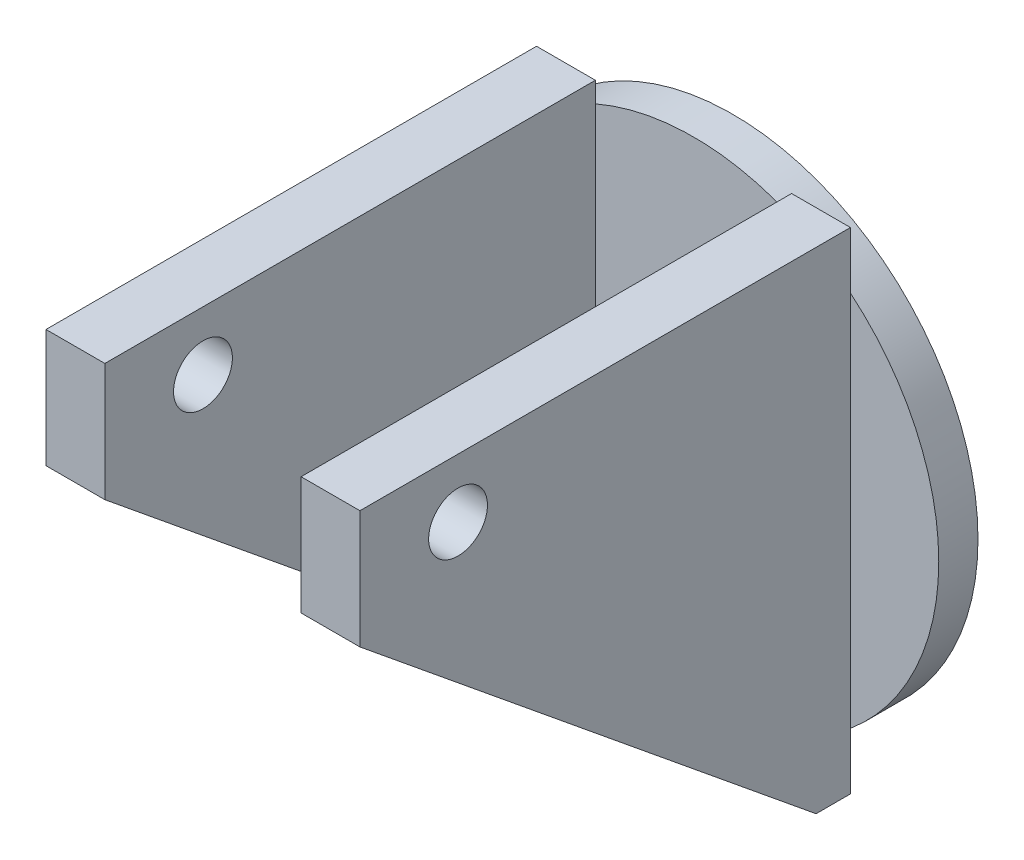
ISO-10303-21;
HEADER;
FILE_DESCRIPTION(('STEP AP214'),'2;1');
FILE_NAME('part.step','',(''),(''),'','','');
FILE_SCHEMA(('AUTOMOTIVE_DESIGN { 1 0 10303 214 1 1 1 1 }'));
ENDSEC;
DATA;
#1=APPLICATION_CONTEXT('core data for automotive mechanical design processes');
#2=APPLICATION_PROTOCOL_DEFINITION('international standard','automotive_design',2000,#1);
#3=PRODUCT_CONTEXT('',#1,'mechanical');
#4=PRODUCT('Part','Part','',(#3));
#5=PRODUCT_RELATED_PRODUCT_CATEGORY('part','',(#4));
#6=PRODUCT_DEFINITION_FORMATION('','',#4);
#7=PRODUCT_DEFINITION_CONTEXT('part definition',#1,'design');
#8=PRODUCT_DEFINITION('design','',#6,#7);
#9=PRODUCT_DEFINITION_SHAPE('','',#8);
#10=(LENGTH_UNIT() NAMED_UNIT(*) SI_UNIT(.MILLI.,.METRE.));
#11=(NAMED_UNIT(*) PLANE_ANGLE_UNIT() SI_UNIT($,.RADIAN.));
#12=(NAMED_UNIT(*) SI_UNIT($,.STERADIAN.) SOLID_ANGLE_UNIT());
#13=UNCERTAINTY_MEASURE_WITH_UNIT(LENGTH_MEASURE(1.E-05),#10,'distance_accuracy_value','');
#14=(GEOMETRIC_REPRESENTATION_CONTEXT(3) GLOBAL_UNCERTAINTY_ASSIGNED_CONTEXT((#13)) GLOBAL_UNIT_ASSIGNED_CONTEXT((#10,
#11,#12)) REPRESENTATION_CONTEXT('',''));
#15=CARTESIAN_POINT('',(0.,0.,0.));
#16=DIRECTION('',(0.,0.,1.));
#17=DIRECTION('',(1.,0.,0.));
#18=AXIS2_PLACEMENT_3D('',#15,#16,#17);
#19=CARTESIAN_POINT('',(0.,0.,2.));
#20=DIRECTION('',(0.,0.,1.));
#21=DIRECTION('',(1.,0.,0.));
#22=AXIS2_PLACEMENT_3D('',#19,#20,#21);
#23=PLANE('',#22);
#24=DIRECTION('',(0.,1.,0.));
#25=VECTOR('',#24,1.);
#26=CARTESIAN_POINT('',(8.,0.,2.));
#27=LINE('',#26,#25);
#28=CARTESIAN_POINT('',(8.,-9.60468635614927,2.));
#29=VERTEX_POINT('',#28);
#30=CARTESIAN_POINT('',(8.,9.60468635614927,2.));
#31=VERTEX_POINT('',#30);
#32=EDGE_CURVE('E40',#29,#31,#27,.T.);
#33=ORIENTED_EDGE('',*,*,#32,.F.);
#34=CARTESIAN_POINT('',(0.,0.,2.));
#35=DIRECTION('',(0.,0.,1.));
#36=DIRECTION('',(1.,0.,0.));
#37=AXIS2_PLACEMENT_3D('',#34,#35,#36);
#38=CIRCLE('',#37,12.5);
#39=EDGE_CURVE('E270',#29,#31,#38,.T.);
#40=ORIENTED_EDGE('',*,*,#39,.T.);
#41=EDGE_LOOP('',(#33,#40));
#42=FACE_BOUND('',#41,.T.);
#43=ADVANCED_FACE('F32',(#42),#23,.T.);
#44=DIRECTION('',(0.,-1.,0.));
#45=VECTOR('',#44,1.);
#46=CARTESIAN_POINT('',(-8.,12.5,2.));
#47=LINE('',#46,#45);
#48=CARTESIAN_POINT('',(-8.,9.60468635614927,2.));
#49=VERTEX_POINT('',#48);
#50=CARTESIAN_POINT('',(-8.,-9.60468635614927,2.));
#51=VERTEX_POINT('',#50);
#52=EDGE_CURVE('E181',#49,#51,#47,.T.);
#53=ORIENTED_EDGE('',*,*,#52,.F.);
#54=EDGE_CURVE('E209',#49,#51,#38,.T.);
#55=ORIENTED_EDGE('',*,*,#54,.T.);
#56=EDGE_LOOP('',(#53,#55));
#57=FACE_BOUND('',#56,.T.);
#58=ADVANCED_FACE('F289',(#57),#23,.T.);
#59=CARTESIAN_POINT('',(0.,0.,2.));
#60=DIRECTION('',(0.,0.,-1.));
#61=DIRECTION('',(-1.,0.,0.));
#62=AXIS2_PLACEMENT_3D('',#59,#60,#61);
#63=CYLINDRICAL_SURFACE('',#62,12.5);
#64=CARTESIAN_POINT('',(-5.,11.4564392373896,2.));
#65=VERTEX_POINT('',#64);
#66=EDGE_CURVE('E206',#65,#49,#38,.T.);
#67=ORIENTED_EDGE('',*,*,#66,.F.);
#68=CARTESIAN_POINT('',(5.,11.4564392373896,2.));
#69=VERTEX_POINT('',#68);
#70=EDGE_CURVE('E210',#69,#65,#38,.T.);
#71=ORIENTED_EDGE('',*,*,#70,.F.);
#72=EDGE_CURVE('E257',#31,#69,#38,.T.);
#73=ORIENTED_EDGE('',*,*,#72,.F.);
#74=ORIENTED_EDGE('',*,*,#39,.F.);
#75=CARTESIAN_POINT('',(5.,-11.4564392373896,2.));
#76=VERTEX_POINT('',#75);
#77=EDGE_CURVE('E276',#76,#29,#38,.T.);
#78=ORIENTED_EDGE('',*,*,#77,.F.);
#79=CARTESIAN_POINT('',(-5.,-11.4564392373896,2.));
#80=VERTEX_POINT('',#79);
#81=EDGE_CURVE('E279',#80,#76,#38,.T.);
#82=ORIENTED_EDGE('',*,*,#81,.F.);
#83=EDGE_CURVE('E280',#51,#80,#38,.T.);
#84=ORIENTED_EDGE('',*,*,#83,.F.);
#85=ORIENTED_EDGE('',*,*,#54,.F.);
#86=EDGE_LOOP('',(#67,#71,#73,#74,#78,#82,#84,#85));
#87=FACE_BOUND('',#86,.T.);
#88=CARTESIAN_POINT('',(0.,0.,0.));
#89=DIRECTION('',(0.,0.,1.));
#90=DIRECTION('',(1.,0.,0.));
#91=AXIS2_PLACEMENT_3D('',#88,#89,#90);
#92=CIRCLE('',#91,12.5);
#93=CARTESIAN_POINT('',(12.5,0.,0.));
#94=VERTEX_POINT('',#93);
#95=EDGE_CURVE('E202',#94,#94,#92,.T.);
#96=ORIENTED_EDGE('',*,*,#95,.T.);
#97=EDGE_LOOP('',(#96));
#98=FACE_BOUND('',#97,.T.);
#99=ADVANCED_FACE('F34',(#87,#98),#63,.T.);
#100=DIRECTION('',(0.,-1.,0.));
#101=VECTOR('',#100,1.);
#102=CARTESIAN_POINT('',(5.,0.,2.));
#103=LINE('',#102,#101);
#104=EDGE_CURVE('E213',#69,#76,#103,.T.);
#105=ORIENTED_EDGE('',*,*,#104,.F.);
#106=ORIENTED_EDGE('',*,*,#70,.T.);
#107=DIRECTION('',(0.,1.,0.));
#108=VECTOR('',#107,1.);
#109=CARTESIAN_POINT('',(-5.,12.5,2.));
#110=LINE('',#109,#108);
#111=EDGE_CURVE('E188',#80,#65,#110,.T.);
#112=ORIENTED_EDGE('',*,*,#111,.F.);
#113=ORIENTED_EDGE('',*,*,#81,.T.);
#114=EDGE_LOOP('',(#105,#106,#112,#113));
#115=FACE_BOUND('',#114,.T.);
#116=ADVANCED_FACE('F311',(#115),#23,.T.);
#117=CARTESIAN_POINT('',(0.,0.,0.));
#118=DIRECTION('',(0.,0.,1.));
#119=DIRECTION('',(1.,0.,0.));
#120=AXIS2_PLACEMENT_3D('',#117,#118,#119);
#121=PLANE('',#120);
#122=CARTESIAN_POINT('',(0.,0.,0.));
#123=DIRECTION('',(0.,0.,-1.));
#124=DIRECTION('',(-1.,0.,0.));
#125=AXIS2_PLACEMENT_3D('',#122,#123,#124);
#126=CIRCLE('',#125,2.);
#127=CARTESIAN_POINT('',(-2.,0.,0.));
#128=VERTEX_POINT('',#127);
#129=EDGE_CURVE('E203',#128,#128,#126,.T.);
#130=ORIENTED_EDGE('',*,*,#129,.F.);
#131=EDGE_LOOP('',(#130));
#132=FACE_BOUND('',#131,.T.);
#133=ORIENTED_EDGE('',*,*,#95,.F.);
#134=EDGE_LOOP('',(#133));
#135=FACE_BOUND('',#134,.T.);
#136=ADVANCED_FACE('F333',(#132,#135),#121,.F.);
#137=CARTESIAN_POINT('',(0.,0.,-1.));
#138=DIRECTION('',(0.,0.,1.));
#139=DIRECTION('',(1.,0.,0.));
#140=AXIS2_PLACEMENT_3D('',#137,#138,#139);
#141=CYLINDRICAL_SURFACE('',#140,2.);
#142=CARTESIAN_POINT('',(0.,0.,-1.));
#143=DIRECTION('',(0.,0.,-1.));
#144=DIRECTION('',(-1.,0.,0.));
#145=AXIS2_PLACEMENT_3D('',#142,#143,#144);
#146=CIRCLE('',#145,2.);
#147=CARTESIAN_POINT('',(-2.,0.,-1.));
#148=VERTEX_POINT('',#147);
#149=EDGE_CURVE('E199',#148,#148,#146,.T.);
#150=ORIENTED_EDGE('',*,*,#149,.F.);
#151=EDGE_LOOP('',(#150));
#152=FACE_BOUND('',#151,.T.);
#153=ORIENTED_EDGE('',*,*,#129,.T.);
#154=EDGE_LOOP('',(#153));
#155=FACE_BOUND('',#154,.T.);
#156=ADVANCED_FACE('F338',(#152,#155),#141,.T.);
#157=CARTESIAN_POINT('',(0.,0.,-1.));
#158=DIRECTION('',(0.,0.,-1.));
#159=DIRECTION('',(-1.,0.,0.));
#160=AXIS2_PLACEMENT_3D('',#157,#158,#159);
#161=PLANE('',#160);
#162=ORIENTED_EDGE('',*,*,#149,.T.);
#163=EDGE_LOOP('',(#162));
#164=FACE_BOUND('',#163,.T.);
#165=ADVANCED_FACE('F354',(#164),#161,.T.);
#166=CARTESIAN_POINT('',(0.,0.,2.));
#167=DIRECTION('',(0.,0.,1.));
#168=DIRECTION('',(1.,0.,0.));
#169=AXIS2_PLACEMENT_3D('',#166,#167,#168);
#170=PLANE('',#169);
#171=CARTESIAN_POINT('',(-5.,12.5,2.));
#172=VERTEX_POINT('',#171);
#173=EDGE_CURVE('E184',#65,#172,#110,.T.);
#174=ORIENTED_EDGE('',*,*,#173,.F.);
#175=ORIENTED_EDGE('',*,*,#66,.T.);
#176=CARTESIAN_POINT('',(-8.,12.5,2.));
#177=VERTEX_POINT('',#176);
#178=EDGE_CURVE('E177',#177,#49,#47,.T.);
#179=ORIENTED_EDGE('',*,*,#178,.F.);
#180=DIRECTION('',(-1.,0.,0.));
#181=VECTOR('',#180,1.);
#182=CARTESIAN_POINT('',(-8.,12.5,2.));
#183=LINE('',#182,#181);
#184=EDGE_CURVE('E172',#172,#177,#183,.T.);
#185=ORIENTED_EDGE('',*,*,#184,.F.);
#186=EDGE_LOOP('',(#174,#175,#179,#185));
#187=FACE_BOUND('',#186,.T.);
#188=ADVANCED_FACE('F310',(#187),#170,.F.);
#189=CARTESIAN_POINT('',(-8.,-12.5,2.));
#190=VERTEX_POINT('',#189);
#191=EDGE_CURVE('E167',#51,#190,#47,.T.);
#192=ORIENTED_EDGE('',*,*,#191,.F.);
#193=ORIENTED_EDGE('',*,*,#83,.T.);
#194=CARTESIAN_POINT('',(-5.,-12.5,2.));
#195=VERTEX_POINT('',#194);
#196=EDGE_CURVE('E185',#195,#80,#110,.T.);
#197=ORIENTED_EDGE('',*,*,#196,.F.);
#198=DIRECTION('',(1.,0.,0.));
#199=VECTOR('',#198,1.);
#200=CARTESIAN_POINT('',(-8.,-12.5,2.));
#201=LINE('',#200,#199);
#202=EDGE_CURVE('E180',#190,#195,#201,.T.);
#203=ORIENTED_EDGE('',*,*,#202,.F.);
#204=EDGE_LOOP('',(#192,#193,#197,#203));
#205=FACE_BOUND('',#204,.T.);
#206=ADVANCED_FACE('F293',(#205),#170,.F.);
#207=CARTESIAN_POINT('',(-8.,12.5,27.));
#208=DIRECTION('',(1.,0.,0.));
#209=DIRECTION('',(0.,1.,0.));
#210=AXIS2_PLACEMENT_3D('',#207,#208,#209);
#211=PLANE('',#210);
#212=CARTESIAN_POINT('',(-8.,9.5,22.));
#213=DIRECTION('',(-1.,0.,0.));
#214=DIRECTION('',(0.,-1.,0.));
#215=AXIS2_PLACEMENT_3D('',#212,#213,#214);
#216=CIRCLE('',#215,1.5);
#217=CARTESIAN_POINT('',(-8.,8.,22.));
#218=VERTEX_POINT('',#217);
#219=EDGE_CURVE('E220',#218,#218,#216,.T.);
#220=ORIENTED_EDGE('',*,*,#219,.F.);
#221=EDGE_LOOP('',(#220));
#222=FACE_BOUND('',#221,.T.);
#223=DIRECTION('',(0.,0.,-1.));
#224=VECTOR('',#223,1.);
#225=CARTESIAN_POINT('',(-8.,-12.5,27.));
#226=LINE('',#225,#224);
#227=CARTESIAN_POINT('',(-8.,-12.5,3.75178050014213));
#228=VERTEX_POINT('',#227);
#229=EDGE_CURVE('E197',#228,#190,#226,.T.);
#230=ORIENTED_EDGE('',*,*,#229,.F.);
#231=DIRECTION('',(0.,0.632523688783687,0.77454101449018));
#232=VECTOR('',#231,1.);
#233=CARTESIAN_POINT('',(-8.,8.89181942281559,29.9465963012696));
#234=LINE('',#233,#232);
#235=CARTESIAN_POINT('',(-8.,6.48550145260174,27.));
#236=VERTEX_POINT('',#235);
#237=EDGE_CURVE('E227',#228,#236,#234,.T.);
#238=ORIENTED_EDGE('',*,*,#237,.T.);
#239=DIRECTION('',(0.,-1.,0.));
#240=VECTOR('',#239,1.);
#241=CARTESIAN_POINT('',(-8.,12.5,27.));
#242=LINE('',#241,#240);
#243=CARTESIAN_POINT('',(-8.,12.5,27.));
#244=VERTEX_POINT('',#243);
#245=EDGE_CURVE('E168',#244,#236,#242,.T.);
#246=ORIENTED_EDGE('',*,*,#245,.F.);
#247=DIRECTION('',(0.,0.,-1.));
#248=VECTOR('',#247,1.);
#249=CARTESIAN_POINT('',(-8.,12.5,27.));
#250=LINE('',#249,#248);
#251=EDGE_CURVE('E176',#244,#177,#250,.T.);
#252=ORIENTED_EDGE('',*,*,#251,.T.);
#253=ORIENTED_EDGE('',*,*,#178,.T.);
#254=ORIENTED_EDGE('',*,*,#52,.T.);
#255=ORIENTED_EDGE('',*,*,#191,.T.);
#256=EDGE_LOOP('',(#230,#238,#246,#252,#253,#254,#255));
#257=FACE_BOUND('',#256,.T.);
#258=ADVANCED_FACE('F296',(#222,#257),#211,.F.);
#259=CARTESIAN_POINT('',(-8.,-12.5,27.));
#260=DIRECTION('',(0.,1.,0.));
#261=DIRECTION('',(-1.,0.,0.));
#262=AXIS2_PLACEMENT_3D('',#259,#260,#261);
#263=PLANE('',#262);
#264=DIRECTION('',(0.,0.,-1.));
#265=VECTOR('',#264,1.);
#266=CARTESIAN_POINT('',(-5.,-12.5,27.));
#267=LINE('',#266,#265);
#268=CARTESIAN_POINT('',(-5.,-12.5,3.75178050014213));
#269=VERTEX_POINT('',#268);
#270=EDGE_CURVE('E195',#269,#195,#267,.T.);
#271=ORIENTED_EDGE('',*,*,#270,.F.);
#272=DIRECTION('',(1.,0.,0.));
#273=VECTOR('',#272,1.);
#274=CARTESIAN_POINT('',(-12.5,-12.5,3.75178050014213));
#275=LINE('',#274,#273);
#276=EDGE_CURVE('E137',#228,#269,#275,.T.);
#277=ORIENTED_EDGE('',*,*,#276,.F.);
#278=ORIENTED_EDGE('',*,*,#229,.T.);
#279=ORIENTED_EDGE('',*,*,#202,.T.);
#280=EDGE_LOOP('',(#271,#277,#278,#279));
#281=FACE_BOUND('',#280,.T.);
#282=ADVANCED_FACE('F471',(#281),#263,.F.);
#283=CARTESIAN_POINT('',(-5.,12.5,27.));
#284=DIRECTION('',(-1.,0.,0.));
#285=DIRECTION('',(0.,-1.,0.));
#286=AXIS2_PLACEMENT_3D('',#283,#284,#285);
#287=PLANE('',#286);
#288=CARTESIAN_POINT('',(-5.,9.5,22.));
#289=DIRECTION('',(-1.,0.,0.));
#290=DIRECTION('',(0.,-1.,0.));
#291=AXIS2_PLACEMENT_3D('',#288,#289,#290);
#292=CIRCLE('',#291,1.5);
#293=CARTESIAN_POINT('',(-5.,8.,22.));
#294=VERTEX_POINT('',#293);
#295=EDGE_CURVE('E224',#294,#294,#292,.T.);
#296=ORIENTED_EDGE('',*,*,#295,.T.);
#297=EDGE_LOOP('',(#296));
#298=FACE_BOUND('',#297,.T.);
#299=DIRECTION('',(0.,1.,0.));
#300=VECTOR('',#299,1.);
#301=CARTESIAN_POINT('',(-5.,12.5,27.));
#302=LINE('',#301,#300);
#303=CARTESIAN_POINT('',(-5.,6.48550145260174,27.));
#304=VERTEX_POINT('',#303);
#305=CARTESIAN_POINT('',(-5.,12.5,27.));
#306=VERTEX_POINT('',#305);
#307=EDGE_CURVE('E171',#304,#306,#302,.T.);
#308=ORIENTED_EDGE('',*,*,#307,.F.);
#309=DIRECTION('',(0.,-0.632523688783687,-0.77454101449018));
#310=VECTOR('',#309,1.);
#311=CARTESIAN_POINT('',(-5.,8.89181942281559,29.9465963012696));
#312=LINE('',#311,#310);
#313=EDGE_CURVE('E47',#304,#269,#312,.T.);
#314=ORIENTED_EDGE('',*,*,#313,.T.);
#315=ORIENTED_EDGE('',*,*,#270,.T.);
#316=ORIENTED_EDGE('',*,*,#196,.T.);
#317=ORIENTED_EDGE('',*,*,#111,.T.);
#318=ORIENTED_EDGE('',*,*,#173,.T.);
#319=DIRECTION('',(0.,0.,-1.));
#320=VECTOR('',#319,1.);
#321=CARTESIAN_POINT('',(-5.,12.5,27.));
#322=LINE('',#321,#320);
#323=EDGE_CURVE('E192',#306,#172,#322,.T.);
#324=ORIENTED_EDGE('',*,*,#323,.F.);
#325=EDGE_LOOP('',(#308,#314,#315,#316,#317,#318,#324));
#326=FACE_BOUND('',#325,.T.);
#327=ADVANCED_FACE('F303',(#298,#326),#287,.F.);
#328=CARTESIAN_POINT('',(-8.,12.5,27.));
#329=DIRECTION('',(0.,-1.,0.));
#330=DIRECTION('',(0.,0.,-1.));
#331=AXIS2_PLACEMENT_3D('',#328,#329,#330);
#332=PLANE('',#331);
#333=ORIENTED_EDGE('',*,*,#184,.T.);
#334=ORIENTED_EDGE('',*,*,#251,.F.);
#335=DIRECTION('',(-1.,0.,0.));
#336=VECTOR('',#335,1.);
#337=CARTESIAN_POINT('',(-8.,12.5,27.));
#338=LINE('',#337,#336);
#339=EDGE_CURVE('E174',#306,#244,#338,.T.);
#340=ORIENTED_EDGE('',*,*,#339,.F.);
#341=ORIENTED_EDGE('',*,*,#323,.T.);
#342=EDGE_LOOP('',(#333,#334,#340,#341));
#343=FACE_BOUND('',#342,.T.);
#344=ADVANCED_FACE('F308',(#343),#332,.F.);
#345=CARTESIAN_POINT('',(0.,0.,27.));
#346=DIRECTION('',(0.,0.,1.));
#347=DIRECTION('',(1.,0.,0.));
#348=AXIS2_PLACEMENT_3D('',#345,#346,#347);
#349=PLANE('',#348);
#350=DIRECTION('',(1.,0.,0.));
#351=VECTOR('',#350,1.);
#352=CARTESIAN_POINT('',(-12.5,6.48550145260174,27.));
#353=LINE('',#352,#351);
#354=EDGE_CURVE('E312',#236,#304,#353,.T.);
#355=ORIENTED_EDGE('',*,*,#354,.T.);
#356=ORIENTED_EDGE('',*,*,#307,.T.);
#357=ORIENTED_EDGE('',*,*,#339,.T.);
#358=ORIENTED_EDGE('',*,*,#245,.T.);
#359=EDGE_LOOP('',(#355,#356,#357,#358));
#360=FACE_BOUND('',#359,.T.);
#361=ADVANCED_FACE('F377',(#360),#349,.T.);
#362=CARTESIAN_POINT('',(0.,0.,2.));
#363=DIRECTION('',(0.,0.,1.));
#364=DIRECTION('',(-1.,0.,0.));
#365=AXIS2_PLACEMENT_3D('',#362,#363,#364);
#366=PLANE('',#365);
#367=DIRECTION('',(0.,-1.,0.));
#368=VECTOR('',#367,1.);
#369=CARTESIAN_POINT('',(8.,12.5,2.));
#370=LINE('',#369,#368);
#371=CARTESIAN_POINT('',(8.,12.5,2.));
#372=VERTEX_POINT('',#371);
#373=EDGE_CURVE('E241',#372,#31,#370,.T.);
#374=ORIENTED_EDGE('',*,*,#373,.T.);
#375=ORIENTED_EDGE('',*,*,#72,.T.);
#376=DIRECTION('',(0.,1.,0.));
#377=VECTOR('',#376,1.);
#378=CARTESIAN_POINT('',(5.,12.5,2.));
#379=LINE('',#378,#377);
#380=CARTESIAN_POINT('',(5.,12.5,2.));
#381=VERTEX_POINT('',#380);
#382=EDGE_CURVE('E246',#69,#381,#379,.T.);
#383=ORIENTED_EDGE('',*,*,#382,.T.);
#384=DIRECTION('',(1.,0.,0.));
#385=VECTOR('',#384,1.);
#386=CARTESIAN_POINT('',(8.,12.5,2.));
#387=LINE('',#386,#385);
#388=EDGE_CURVE('E244',#381,#372,#387,.T.);
#389=ORIENTED_EDGE('',*,*,#388,.T.);
#390=EDGE_LOOP('',(#374,#375,#383,#389));
#391=FACE_BOUND('',#390,.T.);
#392=ADVANCED_FACE('F255',(#391),#366,.F.);
#393=CARTESIAN_POINT('',(8.,12.5,27.));
#394=DIRECTION('',(1.,0.,0.));
#395=DIRECTION('',(0.,1.,0.));
#396=AXIS2_PLACEMENT_3D('',#393,#394,#395);
#397=PLANE('',#396);
#398=DIRECTION('',(0.,0.632523688783687,0.77454101449018));
#399=VECTOR('',#398,1.);
#400=CARTESIAN_POINT('',(8.,6.48550145260174,27.));
#401=LINE('',#400,#399);
#402=CARTESIAN_POINT('',(8.,-12.5,3.75178050014213));
#403=VERTEX_POINT('',#402);
#404=CARTESIAN_POINT('',(8.,6.48550145260174,27.));
#405=VERTEX_POINT('',#404);
#406=EDGE_CURVE('E54',#403,#405,#401,.T.);
#407=ORIENTED_EDGE('',*,*,#406,.F.);
#408=DIRECTION('',(0.,0.,-1.));
#409=VECTOR('',#408,1.);
#410=CARTESIAN_POINT('',(8.,-12.5,27.));
#411=LINE('',#410,#409);
#412=CARTESIAN_POINT('',(8.,-12.5,2.));
#413=VERTEX_POINT('',#412);
#414=EDGE_CURVE('E144',#403,#413,#411,.T.);
#415=ORIENTED_EDGE('',*,*,#414,.T.);
#416=EDGE_CURVE('E237',#29,#413,#370,.T.);
#417=ORIENTED_EDGE('',*,*,#416,.F.);
#418=ORIENTED_EDGE('',*,*,#32,.T.);
#419=ORIENTED_EDGE('',*,*,#373,.F.);
#420=DIRECTION('',(0.,0.,-1.));
#421=VECTOR('',#420,1.);
#422=CARTESIAN_POINT('',(8.,12.5,27.));
#423=LINE('',#422,#421);
#424=CARTESIAN_POINT('',(8.,12.5,27.));
#425=VERTEX_POINT('',#424);
#426=EDGE_CURVE('E165',#425,#372,#423,.T.);
#427=ORIENTED_EDGE('',*,*,#426,.F.);
#428=DIRECTION('',(0.,-1.,0.));
#429=VECTOR('',#428,1.);
#430=CARTESIAN_POINT('',(8.,12.5,27.));
#431=LINE('',#430,#429);
#432=EDGE_CURVE('E147',#425,#405,#431,.T.);
#433=ORIENTED_EDGE('',*,*,#432,.T.);
#434=EDGE_LOOP('',(#407,#415,#417,#418,#419,#427,#433));
#435=FACE_BOUND('',#434,.T.);
#436=CARTESIAN_POINT('',(8.,9.50000000000001,22.));
#437=DIRECTION('',(1.,0.,0.));
#438=DIRECTION('',(0.,1.,0.));
#439=AXIS2_PLACEMENT_3D('',#436,#437,#438);
#440=CIRCLE('',#439,1.5);
#441=CARTESIAN_POINT('',(8.,8.,22.));
#442=VERTEX_POINT('',#441);
#443=EDGE_CURVE('E219',#442,#442,#440,.T.);
#444=ORIENTED_EDGE('',*,*,#443,.F.);
#445=EDGE_LOOP('',(#444));
#446=FACE_BOUND('',#445,.T.);
#447=ADVANCED_FACE('F141',(#435,#446),#397,.T.);
#448=CARTESIAN_POINT('',(8.,12.5,27.));
#449=DIRECTION('',(0.,1.,0.));
#450=DIRECTION('',(0.,0.,1.));
#451=AXIS2_PLACEMENT_3D('',#448,#449,#450);
#452=PLANE('',#451);
#453=ORIENTED_EDGE('',*,*,#388,.F.);
#454=DIRECTION('',(0.,0.,-1.));
#455=VECTOR('',#454,1.);
#456=CARTESIAN_POINT('',(5.,12.5,27.));
#457=LINE('',#456,#455);
#458=CARTESIAN_POINT('',(5.,12.5,27.));
#459=VERTEX_POINT('',#458);
#460=EDGE_CURVE('E156',#459,#381,#457,.T.);
#461=ORIENTED_EDGE('',*,*,#460,.F.);
#462=DIRECTION('',(1.,0.,0.));
#463=VECTOR('',#462,1.);
#464=CARTESIAN_POINT('',(8.,12.5,27.));
#465=LINE('',#464,#463);
#466=EDGE_CURVE('E158',#459,#425,#465,.T.);
#467=ORIENTED_EDGE('',*,*,#466,.T.);
#468=ORIENTED_EDGE('',*,*,#426,.T.);
#469=EDGE_LOOP('',(#453,#461,#467,#468));
#470=FACE_BOUND('',#469,.T.);
#471=ADVANCED_FACE('F265',(#470),#452,.T.);
#472=CARTESIAN_POINT('',(5.,12.5,27.));
#473=DIRECTION('',(-1.,0.,0.));
#474=DIRECTION('',(0.,-1.,0.));
#475=AXIS2_PLACEMENT_3D('',#472,#473,#474);
#476=PLANE('',#475);
#477=DIRECTION('',(0.,-0.632523688783687,-0.77454101449018));
#478=VECTOR('',#477,1.);
#479=CARTESIAN_POINT('',(5.,8.89181942281559,29.9465963012696));
#480=LINE('',#479,#478);
#481=CARTESIAN_POINT('',(5.,6.48550145260174,27.));
#482=VERTEX_POINT('',#481);
#483=CARTESIAN_POINT('',(5.,-12.5,3.75178050014213));
#484=VERTEX_POINT('',#483);
#485=EDGE_CURVE('E133',#482,#484,#480,.T.);
#486=ORIENTED_EDGE('',*,*,#485,.F.);
#487=DIRECTION('',(0.,1.,0.));
#488=VECTOR('',#487,1.);
#489=CARTESIAN_POINT('',(5.,12.5,27.));
#490=LINE('',#489,#488);
#491=EDGE_CURVE('E154',#482,#459,#490,.T.);
#492=ORIENTED_EDGE('',*,*,#491,.T.);
#493=ORIENTED_EDGE('',*,*,#460,.T.);
#494=ORIENTED_EDGE('',*,*,#382,.F.);
#495=ORIENTED_EDGE('',*,*,#104,.T.);
#496=CARTESIAN_POINT('',(5.,-12.5,2.));
#497=VERTEX_POINT('',#496);
#498=EDGE_CURVE('E247',#497,#76,#379,.T.);
#499=ORIENTED_EDGE('',*,*,#498,.F.);
#500=DIRECTION('',(0.,0.,-1.));
#501=VECTOR('',#500,1.);
#502=CARTESIAN_POINT('',(5.,-12.5,27.));
#503=LINE('',#502,#501);
#504=EDGE_CURVE('E153',#484,#497,#503,.T.);
#505=ORIENTED_EDGE('',*,*,#504,.F.);
#506=EDGE_LOOP('',(#486,#492,#493,#494,#495,#499,#505));
#507=FACE_BOUND('',#506,.T.);
#508=CARTESIAN_POINT('',(5.,9.5,22.));
#509=DIRECTION('',(-1.,0.,0.));
#510=DIRECTION('',(0.,-1.,0.));
#511=AXIS2_PLACEMENT_3D('',#508,#509,#510);
#512=CIRCLE('',#511,1.5);
#513=CARTESIAN_POINT('',(5.,8.,22.));
#514=VERTEX_POINT('',#513);
#515=EDGE_CURVE('E217',#514,#514,#512,.T.);
#516=ORIENTED_EDGE('',*,*,#515,.F.);
#517=EDGE_LOOP('',(#516));
#518=FACE_BOUND('',#517,.T.);
#519=ADVANCED_FACE('F260',(#507,#518),#476,.T.);
#520=CARTESIAN_POINT('',(8.,-12.5,27.));
#521=DIRECTION('',(0.,-1.,0.));
#522=DIRECTION('',(1.,0.,0.));
#523=AXIS2_PLACEMENT_3D('',#520,#521,#522);
#524=PLANE('',#523);
#525=EDGE_CURVE('E130',#484,#403,#275,.T.);
#526=ORIENTED_EDGE('',*,*,#525,.F.);
#527=ORIENTED_EDGE('',*,*,#504,.T.);
#528=DIRECTION('',(-1.,0.,0.));
#529=VECTOR('',#528,1.);
#530=CARTESIAN_POINT('',(8.,-12.5,2.));
#531=LINE('',#530,#529);
#532=EDGE_CURVE('E152',#413,#497,#531,.T.);
#533=ORIENTED_EDGE('',*,*,#532,.F.);
#534=ORIENTED_EDGE('',*,*,#414,.F.);
#535=EDGE_LOOP('',(#526,#527,#533,#534));
#536=FACE_BOUND('',#535,.T.);
#537=ADVANCED_FACE('F150',(#536),#524,.T.);
#538=CARTESIAN_POINT('',(0.,0.,27.));
#539=DIRECTION('',(0.,0.,1.));
#540=DIRECTION('',(-1.,0.,0.));
#541=AXIS2_PLACEMENT_3D('',#538,#539,#540);
#542=PLANE('',#541);
#543=DIRECTION('',(-1.,0.,0.));
#544=VECTOR('',#543,1.);
#545=CARTESIAN_POINT('',(0.,6.48550145260174,27.));
#546=LINE('',#545,#544);
#547=EDGE_CURVE('E11',#405,#482,#546,.T.);
#548=ORIENTED_EDGE('',*,*,#547,.F.);
#549=ORIENTED_EDGE('',*,*,#432,.F.);
#550=ORIENTED_EDGE('',*,*,#466,.F.);
#551=ORIENTED_EDGE('',*,*,#491,.F.);
#552=EDGE_LOOP('',(#548,#549,#550,#551));
#553=FACE_BOUND('',#552,.T.);
#554=ADVANCED_FACE('F315',(#553),#542,.T.);
#555=ORIENTED_EDGE('',*,*,#498,.T.);
#556=ORIENTED_EDGE('',*,*,#77,.T.);
#557=ORIENTED_EDGE('',*,*,#416,.T.);
#558=ORIENTED_EDGE('',*,*,#532,.T.);
#559=EDGE_LOOP('',(#555,#556,#557,#558));
#560=FACE_BOUND('',#559,.T.);
#561=ADVANCED_FACE('F278',(#560),#366,.F.);
#562=CARTESIAN_POINT('',(12.5,9.50000000000001,22.));
#563=DIRECTION('',(-1.,0.,0.));
#564=DIRECTION('',(0.,-1.,0.));
#565=AXIS2_PLACEMENT_3D('',#562,#563,#564);
#566=CYLINDRICAL_SURFACE('',#565,1.5);
#567=CARTESIAN_POINT('',(8.,8.,22.));
#568=CARTESIAN_POINT('',(7.96875,8.,22.));
#569=CARTESIAN_POINT('',(7.9375,8.,22.));
#570=CARTESIAN_POINT('',(7.875,8.,22.));
#571=CARTESIAN_POINT('',(7.84375,8.,22.));
#572=CARTESIAN_POINT('',(7.78125,8.,22.));
#573=CARTESIAN_POINT('',(7.75,8.,22.));
#574=CARTESIAN_POINT('',(7.6875,8.,22.));
#575=CARTESIAN_POINT('',(7.65625,8.,22.));
#576=CARTESIAN_POINT('',(7.59375,8.,22.));
#577=CARTESIAN_POINT('',(7.5625,8.,22.));
#578=CARTESIAN_POINT('',(7.5,8.,22.));
#579=CARTESIAN_POINT('',(7.46875,8.,22.));
#580=CARTESIAN_POINT('',(7.40625,8.,22.));
#581=CARTESIAN_POINT('',(7.375,8.,22.));
#582=CARTESIAN_POINT('',(7.3125,8.,22.));
#583=CARTESIAN_POINT('',(7.28125,8.,22.));
#584=CARTESIAN_POINT('',(7.21875,8.,22.));
#585=CARTESIAN_POINT('',(7.1875,8.,22.));
#586=CARTESIAN_POINT('',(7.125,8.,22.));
#587=CARTESIAN_POINT('',(7.09375,8.,22.));
#588=CARTESIAN_POINT('',(7.03125,8.,22.));
#589=CARTESIAN_POINT('',(7.,8.,22.));
#590=CARTESIAN_POINT('',(6.9375,8.,22.));
#591=CARTESIAN_POINT('',(6.90625,8.,22.));
#592=CARTESIAN_POINT('',(6.84375,8.,22.));
#593=CARTESIAN_POINT('',(6.8125,8.,22.));
#594=CARTESIAN_POINT('',(6.75,8.,22.));
#595=CARTESIAN_POINT('',(6.71875,8.,22.));
#596=CARTESIAN_POINT('',(6.65625,8.,22.));
#597=CARTESIAN_POINT('',(6.625,8.,22.));
#598=CARTESIAN_POINT('',(6.5625,8.,22.));
#599=CARTESIAN_POINT('',(6.53125,8.,22.));
#600=CARTESIAN_POINT('',(6.46875,8.,22.));
#601=CARTESIAN_POINT('',(6.4375,8.,22.));
#602=CARTESIAN_POINT('',(6.375,8.,22.));
#603=CARTESIAN_POINT('',(6.34375,8.,22.));
#604=CARTESIAN_POINT('',(6.28125,8.,22.));
#605=CARTESIAN_POINT('',(6.25,8.,22.));
#606=CARTESIAN_POINT('',(6.1875,8.,22.));
#607=CARTESIAN_POINT('',(6.15625,8.,22.));
#608=CARTESIAN_POINT('',(6.09375,8.,22.));
#609=CARTESIAN_POINT('',(6.0625,8.,22.));
#610=CARTESIAN_POINT('',(6.,8.,22.));
#611=CARTESIAN_POINT('',(5.96875,8.,22.));
#612=CARTESIAN_POINT('',(5.90625,8.,22.));
#613=CARTESIAN_POINT('',(5.875,8.,22.));
#614=CARTESIAN_POINT('',(5.8125,8.,22.));
#615=CARTESIAN_POINT('',(5.78125,8.,22.));
#616=CARTESIAN_POINT('',(5.71875,8.,22.));
#617=CARTESIAN_POINT('',(5.6875,8.,22.));
#618=CARTESIAN_POINT('',(5.625,8.,22.));
#619=CARTESIAN_POINT('',(5.59375,8.,22.));
#620=CARTESIAN_POINT('',(5.53125,8.,22.));
#621=CARTESIAN_POINT('',(5.5,8.,22.));
#622=CARTESIAN_POINT('',(5.4375,8.,22.));
#623=CARTESIAN_POINT('',(5.40625,8.,22.));
#624=CARTESIAN_POINT('',(5.34375,8.,22.));
#625=CARTESIAN_POINT('',(5.3125,8.,22.));
#626=CARTESIAN_POINT('',(5.25,8.,22.));
#627=CARTESIAN_POINT('',(5.21875,8.,22.));
#628=CARTESIAN_POINT('',(5.15625,8.,22.));
#629=CARTESIAN_POINT('',(5.125,8.,22.));
#630=CARTESIAN_POINT('',(5.0625,8.,22.));
#631=CARTESIAN_POINT('',(5.03125,8.,22.));
#632=CARTESIAN_POINT('',(5.,8.,22.));
#633=B_SPLINE_CURVE_WITH_KNOTS('',3,(#567,#568,#569,#570,#571,#572,#573,#574,#575,#576,#577,
#578,#579,#580,#581,#582,#583,#584,#585,#586,#587,#588,#589,#590,#591,#592,#593,#594,#595,#596,
#597,#598,#599,#600,#601,#602,#603,#604,#605,#606,#607,#608,#609,#610,#611,#612,#613,#614,#615,
#616,#617,#618,#619,#620,#621,#622,#623,#624,#625,#626,#627,#628,#629,#630,#631,#632),
.UNSPECIFIED.,.F.,.F.,(4,2,2,2,2,2,2,2,2,2,2,2,2,2,2,2,2,2,2,2,2,2,2,2,2,2,2,2,2,2,2,2,4),(0.,
0.0937500000000001,0.1875,0.281249999999999,0.374999999999999,0.46875,0.5625,0.65625,0.75,
0.84375,0.937499999999999,1.03125,1.125,1.21875,1.3125,1.40625,1.5,1.59375,1.6875,1.78125,1.875,
1.96875,2.0625,2.15625,2.25,2.34375,2.4375,2.53125,2.625,2.71875,2.8125,2.90625,3.),.UNSPECIFIED.);
#634=EDGE_CURVE('BSEAM322',#442,#514,#633,.T.);
#635=ORIENTED_EDGE('',*,*,#443,.T.);
#636=ORIENTED_EDGE('',*,*,#515,.T.);
#637=ORIENTED_EDGE('',*,*,#634,.T.);
#638=ORIENTED_EDGE('',*,*,#634,.F.);
#639=EDGE_LOOP('',(#635,#637,#636,#638));
#640=FACE_BOUND('',#639,.T.);
#641=ADVANCED_FACE('F322',(#640),#566,.F.);
#642=CARTESIAN_POINT('',(-8.,8.,22.));
#643=CARTESIAN_POINT('',(-7.96875,8.,22.));
#644=CARTESIAN_POINT('',(-7.9375,8.,22.));
#645=CARTESIAN_POINT('',(-7.875,8.,22.));
#646=CARTESIAN_POINT('',(-7.84375,8.,22.));
#647=CARTESIAN_POINT('',(-7.78125,8.,22.));
#648=CARTESIAN_POINT('',(-7.75,8.,22.));
#649=CARTESIAN_POINT('',(-7.6875,8.,22.));
#650=CARTESIAN_POINT('',(-7.65625,8.,22.));
#651=CARTESIAN_POINT('',(-7.59375,8.,22.));
#652=CARTESIAN_POINT('',(-7.5625,8.,22.));
#653=CARTESIAN_POINT('',(-7.5,8.,22.));
#654=CARTESIAN_POINT('',(-7.46875,8.,22.));
#655=CARTESIAN_POINT('',(-7.40625,8.,22.));
#656=CARTESIAN_POINT('',(-7.375,8.,22.));
#657=CARTESIAN_POINT('',(-7.3125,8.,22.));
#658=CARTESIAN_POINT('',(-7.28125,8.,22.));
#659=CARTESIAN_POINT('',(-7.21875,8.,22.));
#660=CARTESIAN_POINT('',(-7.1875,8.,22.));
#661=CARTESIAN_POINT('',(-7.125,8.,22.));
#662=CARTESIAN_POINT('',(-7.09375,8.,22.));
#663=CARTESIAN_POINT('',(-7.03125,8.,22.));
#664=CARTESIAN_POINT('',(-7.,8.,22.));
#665=CARTESIAN_POINT('',(-6.9375,8.,22.));
#666=CARTESIAN_POINT('',(-6.90625,8.,22.));
#667=CARTESIAN_POINT('',(-6.84375,8.,22.));
#668=CARTESIAN_POINT('',(-6.8125,8.,22.));
#669=CARTESIAN_POINT('',(-6.75,8.,22.));
#670=CARTESIAN_POINT('',(-6.71875,8.,22.));
#671=CARTESIAN_POINT('',(-6.65625,8.,22.));
#672=CARTESIAN_POINT('',(-6.625,8.,22.));
#673=CARTESIAN_POINT('',(-6.5625,8.,22.));
#674=CARTESIAN_POINT('',(-6.53125,8.,22.));
#675=CARTESIAN_POINT('',(-6.46875,8.,22.));
#676=CARTESIAN_POINT('',(-6.4375,8.,22.));
#677=CARTESIAN_POINT('',(-6.375,8.,22.));
#678=CARTESIAN_POINT('',(-6.34375,8.,22.));
#679=CARTESIAN_POINT('',(-6.28125,8.,22.));
#680=CARTESIAN_POINT('',(-6.25,8.,22.));
#681=CARTESIAN_POINT('',(-6.1875,8.,22.));
#682=CARTESIAN_POINT('',(-6.15625,8.,22.));
#683=CARTESIAN_POINT('',(-6.09375,8.,22.));
#684=CARTESIAN_POINT('',(-6.0625,8.,22.));
#685=CARTESIAN_POINT('',(-6.,8.,22.));
#686=CARTESIAN_POINT('',(-5.96875,8.,22.));
#687=CARTESIAN_POINT('',(-5.90625,8.,22.));
#688=CARTESIAN_POINT('',(-5.875,8.,22.));
#689=CARTESIAN_POINT('',(-5.8125,8.,22.));
#690=CARTESIAN_POINT('',(-5.78125,8.,22.));
#691=CARTESIAN_POINT('',(-5.71875,8.,22.));
#692=CARTESIAN_POINT('',(-5.6875,8.,22.));
#693=CARTESIAN_POINT('',(-5.625,8.,22.));
#694=CARTESIAN_POINT('',(-5.59375,8.,22.));
#695=CARTESIAN_POINT('',(-5.53125,8.,22.));
#696=CARTESIAN_POINT('',(-5.5,8.,22.));
#697=CARTESIAN_POINT('',(-5.4375,8.,22.));
#698=CARTESIAN_POINT('',(-5.40625,8.,22.));
#699=CARTESIAN_POINT('',(-5.34375,8.,22.));
#700=CARTESIAN_POINT('',(-5.3125,8.,22.));
#701=CARTESIAN_POINT('',(-5.25,8.,22.));
#702=CARTESIAN_POINT('',(-5.21875,8.,22.));
#703=CARTESIAN_POINT('',(-5.15625,8.,22.));
#704=CARTESIAN_POINT('',(-5.125,8.,22.));
#705=CARTESIAN_POINT('',(-5.0625,8.,22.));
#706=CARTESIAN_POINT('',(-5.03125,8.,22.));
#707=CARTESIAN_POINT('',(-5.,8.,22.));
#708=B_SPLINE_CURVE_WITH_KNOTS('',3,(#642,#643,#644,#645,#646,#647,#648,#649,#650,#651,#652,
#653,#654,#655,#656,#657,#658,#659,#660,#661,#662,#663,#664,#665,#666,#667,#668,#669,#670,#671,
#672,#673,#674,#675,#676,#677,#678,#679,#680,#681,#682,#683,#684,#685,#686,#687,#688,#689,#690,
#691,#692,#693,#694,#695,#696,#697,#698,#699,#700,#701,#702,#703,#704,#705,#706,#707),
.UNSPECIFIED.,.F.,.F.,(4,2,2,2,2,2,2,2,2,2,2,2,2,2,2,2,2,2,2,2,2,2,2,2,2,2,2,2,2,2,2,2,4),(0.,
0.0937500000000001,0.1875,0.28125,0.375,0.46875,0.5625,0.656250000000001,0.750000000000001,
0.843750000000001,0.937500000000001,1.03125,1.125,1.21875,1.3125,1.40625,1.5,1.59375,1.6875,
1.78125,1.875,1.96875,2.0625,2.15625,2.25,2.34375,2.4375,2.53125,2.625,2.71875,2.8125,2.90625,
3.),.UNSPECIFIED.);
#709=EDGE_CURVE('BSEAM441',#218,#294,#708,.T.);
#710=ORIENTED_EDGE('',*,*,#219,.T.);
#711=ORIENTED_EDGE('',*,*,#295,.F.);
#712=ORIENTED_EDGE('',*,*,#709,.T.);
#713=ORIENTED_EDGE('',*,*,#709,.F.);
#714=EDGE_LOOP('',(#710,#712,#711,#713));
#715=FACE_BOUND('',#714,.T.);
#716=ADVANCED_FACE('F441',(#715),#566,.F.);
#717=CARTESIAN_POINT('',(-12.5,6.48550145260174,27.));
#718=DIRECTION('',(0.,0.77454101449018,-0.632523688783687));
#719=DIRECTION('',(0.,0.632523688783687,0.77454101449018));
#720=AXIS2_PLACEMENT_3D('',#717,#718,#719);
#721=PLANE('',#720);
#722=ORIENTED_EDGE('',*,*,#485,.T.);
#723=ORIENTED_EDGE('',*,*,#525,.T.);
#724=ORIENTED_EDGE('',*,*,#406,.T.);
#725=ORIENTED_EDGE('',*,*,#547,.T.);
#726=EDGE_LOOP('',(#722,#723,#724,#725));
#727=FACE_BOUND('',#726,.T.);
#728=ADVANCED_FACE('F131',(#727),#721,.F.);
#729=ORIENTED_EDGE('',*,*,#276,.T.);
#730=ORIENTED_EDGE('',*,*,#313,.F.);
#731=ORIENTED_EDGE('',*,*,#354,.F.);
#732=ORIENTED_EDGE('',*,*,#237,.F.);
#733=EDGE_LOOP('',(#729,#730,#731,#732));
#734=FACE_BOUND('',#733,.T.);
#735=ADVANCED_FACE('F455',(#734),#721,.F.);
#736=CLOSED_SHELL('',(#43,#58,#99,#116,#136,#156,#165,#188,#206,#258,#282,#327,#344,#361,#392,
#447,#471,#519,#537,#554,#561,#641,#716,#728,#735));
#737=MANIFOLD_SOLID_BREP('B2',#736);
#738=ADVANCED_BREP_SHAPE_REPRESENTATION('',(#18,#737),#14);
#739=SHAPE_DEFINITION_REPRESENTATION(#9,#738);
ENDSEC;
END-ISO-10303-21;
